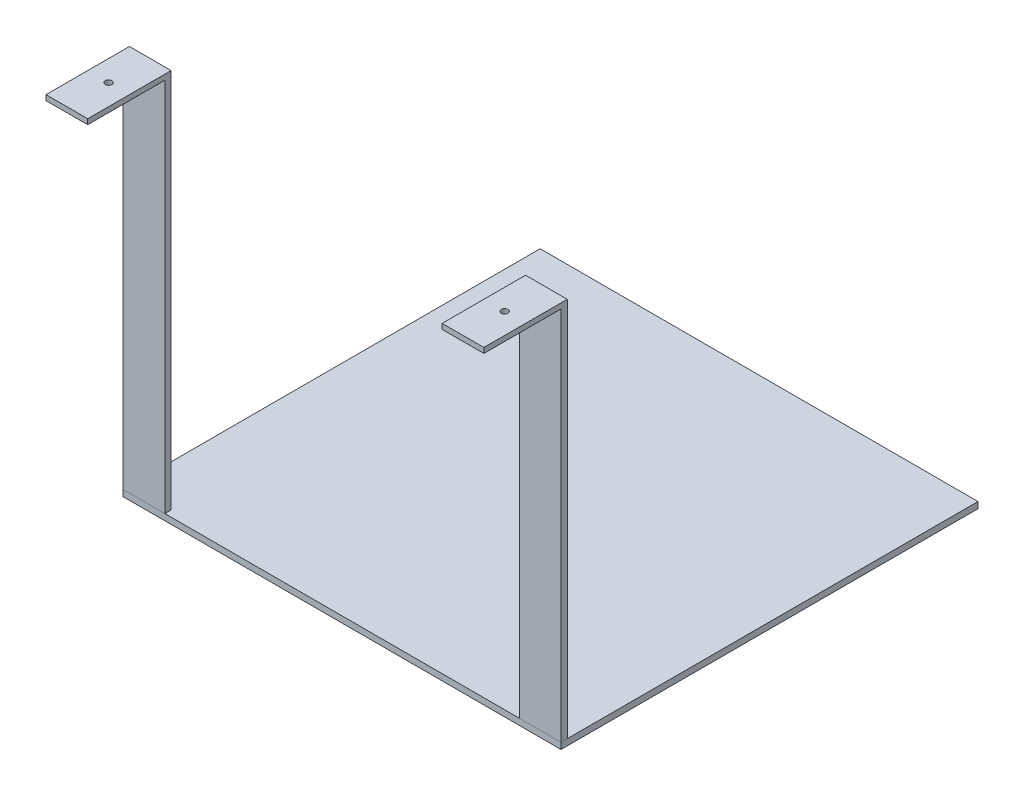
ISO-10303-21;
HEADER;
FILE_DESCRIPTION(('STEP AP214'),'2;1');
FILE_NAME('part.step','',(''),(''),'','','');
FILE_SCHEMA(('AUTOMOTIVE_DESIGN { 1 0 10303 214 1 1 1 1 }'));
ENDSEC;
DATA;
#1=APPLICATION_CONTEXT('core data for automotive mechanical design processes');
#2=APPLICATION_PROTOCOL_DEFINITION('international standard','automotive_design',2000,#1);
#3=PRODUCT_CONTEXT('',#1,'mechanical');
#4=PRODUCT('Part','Part','',(#3));
#5=PRODUCT_RELATED_PRODUCT_CATEGORY('part','',(#4));
#6=PRODUCT_DEFINITION_FORMATION('','',#4);
#7=PRODUCT_DEFINITION_CONTEXT('part definition',#1,'design');
#8=PRODUCT_DEFINITION('design','',#6,#7);
#9=PRODUCT_DEFINITION_SHAPE('','',#8);
#10=(LENGTH_UNIT() NAMED_UNIT(*) SI_UNIT(.MILLI.,.METRE.));
#11=(NAMED_UNIT(*) PLANE_ANGLE_UNIT() SI_UNIT($,.RADIAN.));
#12=(NAMED_UNIT(*) SI_UNIT($,.STERADIAN.) SOLID_ANGLE_UNIT());
#13=UNCERTAINTY_MEASURE_WITH_UNIT(LENGTH_MEASURE(1.E-05),#10,'distance_accuracy_value','');
#14=(GEOMETRIC_REPRESENTATION_CONTEXT(3) GLOBAL_UNCERTAINTY_ASSIGNED_CONTEXT((#13)) GLOBAL_UNIT_ASSIGNED_CONTEXT((#10,
#11,#12)) REPRESENTATION_CONTEXT('',''));
#15=CARTESIAN_POINT('',(0.,0.,0.));
#16=DIRECTION('',(0.,0.,1.));
#17=DIRECTION('',(1.,0.,0.));
#18=AXIS2_PLACEMENT_3D('',#15,#16,#17);
#19=CARTESIAN_POINT('',(-9.99999999999998,-183.,-217.));
#20=DIRECTION('',(0.,0.,1.));
#21=DIRECTION('',(1.,0.,0.));
#22=AXIS2_PLACEMENT_3D('',#19,#20,#21);
#23=PLANE('',#22);
#24=DIRECTION('',(1.,0.,0.));
#25=VECTOR('',#24,1.);
#26=CARTESIAN_POINT('',(-9.99999999999998,-180.,-217.));
#27=LINE('',#26,#25);
#28=CARTESIAN_POINT('',(-9.99999999999998,-180.,-217.));
#29=VERTEX_POINT('',#28);
#30=CARTESIAN_POINT('',(200.,-180.,-217.));
#31=VERTEX_POINT('',#30);
#32=EDGE_CURVE('E108',#29,#31,#27,.T.);
#33=ORIENTED_EDGE('',*,*,#32,.T.);
#34=DIRECTION('',(0.,1.,0.));
#35=VECTOR('',#34,1.);
#36=CARTESIAN_POINT('',(200.,-183.,-217.));
#37=LINE('',#36,#35);
#38=CARTESIAN_POINT('',(200.,-183.,-217.));
#39=VERTEX_POINT('',#38);
#40=EDGE_CURVE('E12',#39,#31,#37,.T.);
#41=ORIENTED_EDGE('',*,*,#40,.F.);
#42=DIRECTION('',(1.,0.,0.));
#43=VECTOR('',#42,1.);
#44=CARTESIAN_POINT('',(-9.99999999999998,-183.,-217.));
#45=LINE('',#44,#43);
#46=CARTESIAN_POINT('',(-9.99999999999998,-183.,-217.));
#47=VERTEX_POINT('',#46);
#48=EDGE_CURVE('E85',#47,#39,#45,.T.);
#49=ORIENTED_EDGE('',*,*,#48,.F.);
#50=DIRECTION('',(0.,1.,0.));
#51=VECTOR('',#50,1.);
#52=CARTESIAN_POINT('',(-9.99999999999998,-183.,-217.));
#53=LINE('',#52,#51);
#54=EDGE_CURVE('E104',#47,#29,#53,.T.);
#55=ORIENTED_EDGE('',*,*,#54,.T.);
#56=EDGE_LOOP('',(#33,#41,#49,#55));
#57=FACE_BOUND('',#56,.T.);
#58=ADVANCED_FACE('F46',(#57),#23,.F.);
#59=CARTESIAN_POINT('',(200.,-183.,-17.));
#60=DIRECTION('',(1.,0.,0.));
#61=DIRECTION('',(0.,0.,-1.));
#62=AXIS2_PLACEMENT_3D('',#59,#60,#61);
#63=PLANE('',#62);
#64=DIRECTION('',(0.,0.,-1.));
#65=VECTOR('',#64,1.);
#66=CARTESIAN_POINT('',(200.,-180.,-17.));
#67=LINE('',#66,#65);
#68=CARTESIAN_POINT('',(200.,-180.,-17.));
#69=VERTEX_POINT('',#68);
#70=EDGE_CURVE('E94',#69,#31,#67,.T.);
#71=ORIENTED_EDGE('',*,*,#70,.F.);
#72=DIRECTION('',(0.,1.,0.));
#73=VECTOR('',#72,1.);
#74=CARTESIAN_POINT('',(200.,-183.,-17.));
#75=LINE('',#74,#73);
#76=CARTESIAN_POINT('',(200.,-183.,-17.));
#77=VERTEX_POINT('',#76);
#78=EDGE_CURVE('E54',#77,#69,#75,.T.);
#79=ORIENTED_EDGE('',*,*,#78,.F.);
#80=DIRECTION('',(0.,0.,-1.));
#81=VECTOR('',#80,1.);
#82=CARTESIAN_POINT('',(200.,-183.,-17.));
#83=LINE('',#82,#81);
#84=EDGE_CURVE('E92',#77,#39,#83,.T.);
#85=ORIENTED_EDGE('',*,*,#84,.T.);
#86=ORIENTED_EDGE('',*,*,#40,.T.);
#87=EDGE_LOOP('',(#71,#79,#85,#86));
#88=FACE_BOUND('',#87,.T.);
#89=ADVANCED_FACE('F91',(#88),#63,.T.);
#90=CARTESIAN_POINT('',(-10.,-183.,-17.));
#91=DIRECTION('',(0.,0.,1.));
#92=DIRECTION('',(1.,0.,0.));
#93=AXIS2_PLACEMENT_3D('',#90,#91,#92);
#94=PLANE('',#93);
#95=DIRECTION('',(1.,0.,0.));
#96=VECTOR('',#95,1.);
#97=CARTESIAN_POINT('',(-10.,-180.,-17.));
#98=LINE('',#97,#96);
#99=CARTESIAN_POINT('',(-10.,-180.,-17.));
#100=VERTEX_POINT('',#99);
#101=EDGE_CURVE('E112',#100,#69,#98,.T.);
#102=ORIENTED_EDGE('',*,*,#101,.F.);
#103=DIRECTION('',(0.,1.,0.));
#104=VECTOR('',#103,1.);
#105=CARTESIAN_POINT('',(-10.,-183.,-17.));
#106=LINE('',#105,#104);
#107=CARTESIAN_POINT('',(-10.,-183.,-17.));
#108=VERTEX_POINT('',#107);
#109=EDGE_CURVE('E77',#108,#100,#106,.T.);
#110=ORIENTED_EDGE('',*,*,#109,.F.);
#111=DIRECTION('',(1.,0.,0.));
#112=VECTOR('',#111,1.);
#113=CARTESIAN_POINT('',(-10.,-183.,-17.));
#114=LINE('',#113,#112);
#115=EDGE_CURVE('E100',#108,#77,#114,.T.);
#116=ORIENTED_EDGE('',*,*,#115,.T.);
#117=ORIENTED_EDGE('',*,*,#78,.T.);
#118=EDGE_LOOP('',(#102,#110,#116,#117));
#119=FACE_BOUND('',#118,.T.);
#120=ADVANCED_FACE('F102',(#119),#94,.T.);
#121=CARTESIAN_POINT('',(-10.,-183.,-17.));
#122=DIRECTION('',(1.,0.,0.));
#123=DIRECTION('',(0.,0.,-1.));
#124=AXIS2_PLACEMENT_3D('',#121,#122,#123);
#125=PLANE('',#124);
#126=DIRECTION('',(0.,0.,-1.));
#127=VECTOR('',#126,1.);
#128=CARTESIAN_POINT('',(-10.,-180.,-17.));
#129=LINE('',#128,#127);
#130=EDGE_CURVE('E80',#100,#29,#129,.T.);
#131=ORIENTED_EDGE('',*,*,#130,.T.);
#132=ORIENTED_EDGE('',*,*,#54,.F.);
#133=DIRECTION('',(0.,0.,-1.));
#134=VECTOR('',#133,1.);
#135=CARTESIAN_POINT('',(-10.,-183.,-17.));
#136=LINE('',#135,#134);
#137=EDGE_CURVE('E62',#108,#47,#136,.T.);
#138=ORIENTED_EDGE('',*,*,#137,.F.);
#139=ORIENTED_EDGE('',*,*,#109,.T.);
#140=EDGE_LOOP('',(#131,#132,#138,#139));
#141=FACE_BOUND('',#140,.T.);
#142=ADVANCED_FACE('F125',(#141),#125,.F.);
#143=CARTESIAN_POINT('',(0.,-183.,0.));
#144=DIRECTION('',(0.,1.,0.));
#145=DIRECTION('',(0.,0.,1.));
#146=AXIS2_PLACEMENT_3D('',#143,#144,#145);
#147=PLANE('',#146);
#148=ORIENTED_EDGE('',*,*,#48,.T.);
#149=ORIENTED_EDGE('',*,*,#84,.F.);
#150=ORIENTED_EDGE('',*,*,#115,.F.);
#151=ORIENTED_EDGE('',*,*,#137,.T.);
#152=EDGE_LOOP('',(#148,#149,#150,#151));
#153=FACE_BOUND('',#152,.T.);
#154=ADVANCED_FACE('F99',(#153),#147,.F.);
#155=CARTESIAN_POINT('',(0.,-180.,0.));
#156=DIRECTION('',(0.,1.,0.));
#157=DIRECTION('',(0.,0.,1.));
#158=AXIS2_PLACEMENT_3D('',#155,#156,#157);
#159=PLANE('',#158);
#160=ORIENTED_EDGE('',*,*,#32,.F.);
#161=ORIENTED_EDGE('',*,*,#130,.F.);
#162=ORIENTED_EDGE('',*,*,#101,.T.);
#163=ORIENTED_EDGE('',*,*,#70,.T.);
#164=EDGE_LOOP('',(#160,#161,#162,#163));
#165=FACE_BOUND('',#164,.T.);
#166=ADVANCED_FACE('F119',(#165),#159,.T.);
#167=CLOSED_SHELL('',(#58,#89,#120,#142,#154,#166));
#168=MANIFOLD_SOLID_BREP('B2',#167);
#169=CARTESIAN_POINT('',(0.,2.5,0.));
#170=DIRECTION('',(0.,-1.,0.));
#171=DIRECTION('',(0.,0.,-1.));
#172=AXIS2_PLACEMENT_3D('',#169,#170,#171);
#173=PLANE('',#172);
#174=DIRECTION('',(0.,0.,1.));
#175=VECTOR('',#174,1.);
#176=CARTESIAN_POINT('',(180.,2.5,20.));
#177=LINE('',#176,#175);
#178=CARTESIAN_POINT('',(180.,2.5,-20.));
#179=VERTEX_POINT('',#178);
#180=CARTESIAN_POINT('',(180.,2.5,20.));
#181=VERTEX_POINT('',#180);
#182=EDGE_CURVE('E273',#179,#181,#177,.T.);
#183=ORIENTED_EDGE('',*,*,#182,.T.);
#184=DIRECTION('',(1.,0.,0.));
#185=VECTOR('',#184,1.);
#186=CARTESIAN_POINT('',(180.,2.5,20.));
#187=LINE('',#186,#185);
#188=CARTESIAN_POINT('',(200.,2.5,20.));
#189=VERTEX_POINT('',#188);
#190=EDGE_CURVE('E223',#181,#189,#187,.T.);
#191=ORIENTED_EDGE('',*,*,#190,.T.);
#192=DIRECTION('',(0.,0.,-1.));
#193=VECTOR('',#192,1.);
#194=CARTESIAN_POINT('',(200.,2.5,20.));
#195=LINE('',#194,#193);
#196=CARTESIAN_POINT('',(200.,2.5,-20.));
#197=VERTEX_POINT('',#196);
#198=EDGE_CURVE('E277',#189,#197,#195,.T.);
#199=ORIENTED_EDGE('',*,*,#198,.T.);
#200=DIRECTION('',(-1.,0.,0.));
#201=VECTOR('',#200,1.);
#202=CARTESIAN_POINT('',(180.,2.5,-20.));
#203=LINE('',#202,#201);
#204=EDGE_CURVE('E203',#197,#179,#203,.T.);
#205=ORIENTED_EDGE('',*,*,#204,.T.);
#206=EDGE_LOOP('',(#183,#191,#199,#205));
#207=FACE_BOUND('',#206,.T.);
#208=CARTESIAN_POINT('',(190.,2.5,0.));
#209=DIRECTION('',(0.,1.,0.));
#210=DIRECTION('',(0.,0.,-1.));
#211=AXIS2_PLACEMENT_3D('',#208,#209,#210);
#212=CIRCLE('',#211,1.59999999999999);
#213=CARTESIAN_POINT('',(190.,2.5,-1.59999999999998));
#214=VERTEX_POINT('',#213);
#215=EDGE_CURVE('E243',#214,#214,#212,.T.);
#216=ORIENTED_EDGE('',*,*,#215,.F.);
#217=EDGE_LOOP('',(#216));
#218=FACE_BOUND('',#217,.T.);
#219=ADVANCED_FACE('F179',(#207,#218),#173,.F.);
#220=CARTESIAN_POINT('',(0.,0.,0.));
#221=DIRECTION('',(0.,-1.,0.));
#222=DIRECTION('',(0.,0.,-1.));
#223=AXIS2_PLACEMENT_3D('',#220,#221,#222);
#224=PLANE('',#223);
#225=DIRECTION('',(-1.,0.,0.));
#226=VECTOR('',#225,1.);
#227=CARTESIAN_POINT('',(200.,0.,-17.));
#228=LINE('',#227,#226);
#229=CARTESIAN_POINT('',(200.,0.,-17.));
#230=VERTEX_POINT('',#229);
#231=CARTESIAN_POINT('',(180.,0.,-17.));
#232=VERTEX_POINT('',#231);
#233=EDGE_CURVE('E194',#230,#232,#228,.T.);
#234=ORIENTED_EDGE('',*,*,#233,.F.);
#235=DIRECTION('',(0.,0.,-1.));
#236=VECTOR('',#235,1.);
#237=CARTESIAN_POINT('',(200.,0.,20.));
#238=LINE('',#237,#236);
#239=CARTESIAN_POINT('',(200.,0.,20.));
#240=VERTEX_POINT('',#239);
#241=EDGE_CURVE('E275',#240,#230,#238,.T.);
#242=ORIENTED_EDGE('',*,*,#241,.F.);
#243=DIRECTION('',(1.,0.,0.));
#244=VECTOR('',#243,1.);
#245=CARTESIAN_POINT('',(180.,0.,20.));
#246=LINE('',#245,#244);
#247=CARTESIAN_POINT('',(180.,0.,20.));
#248=VERTEX_POINT('',#247);
#249=EDGE_CURVE('E218',#248,#240,#246,.T.);
#250=ORIENTED_EDGE('',*,*,#249,.F.);
#251=DIRECTION('',(0.,0.,1.));
#252=VECTOR('',#251,1.);
#253=CARTESIAN_POINT('',(180.,0.,20.));
#254=LINE('',#253,#252);
#255=EDGE_CURVE('E237',#232,#248,#254,.T.);
#256=ORIENTED_EDGE('',*,*,#255,.F.);
#257=EDGE_LOOP('',(#234,#242,#250,#256));
#258=FACE_BOUND('',#257,.T.);
#259=CARTESIAN_POINT('',(190.,0.,0.));
#260=DIRECTION('',(0.,1.,0.));
#261=DIRECTION('',(0.,0.,-1.));
#262=AXIS2_PLACEMENT_3D('',#259,#260,#261);
#263=CIRCLE('',#262,1.59999999999999);
#264=CARTESIAN_POINT('',(190.,0.,-1.59999999999998));
#265=VERTEX_POINT('',#264);
#266=EDGE_CURVE('E253',#265,#265,#263,.T.);
#267=ORIENTED_EDGE('',*,*,#266,.T.);
#268=EDGE_LOOP('',(#267));
#269=FACE_BOUND('',#268,.T.);
#270=ADVANCED_FACE('F238',(#258,#269),#224,.T.);
#271=CARTESIAN_POINT('',(180.,2.5,20.));
#272=DIRECTION('',(1.,0.,0.));
#273=DIRECTION('',(0.,0.,-1.));
#274=AXIS2_PLACEMENT_3D('',#271,#272,#273);
#275=PLANE('',#274);
#276=DIRECTION('',(0.,-1.,0.));
#277=VECTOR('',#276,1.);
#278=CARTESIAN_POINT('',(180.,2.5,-20.));
#279=LINE('',#278,#277);
#280=CARTESIAN_POINT('',(180.,-180.,-20.));
#281=VERTEX_POINT('',#280);
#282=EDGE_CURVE('E279',#179,#281,#279,.T.);
#283=ORIENTED_EDGE('',*,*,#282,.T.);
#284=DIRECTION('',(0.,0.,-1.));
#285=VECTOR('',#284,1.);
#286=CARTESIAN_POINT('',(180.,-180.,-17.));
#287=LINE('',#286,#285);
#288=CARTESIAN_POINT('',(180.,-180.,-17.));
#289=VERTEX_POINT('',#288);
#290=EDGE_CURVE('E257',#289,#281,#287,.T.);
#291=ORIENTED_EDGE('',*,*,#290,.F.);
#292=DIRECTION('',(0.,1.,0.));
#293=VECTOR('',#292,1.);
#294=CARTESIAN_POINT('',(180.,-180.,-17.));
#295=LINE('',#294,#293);
#296=EDGE_CURVE('E250',#289,#232,#295,.T.);
#297=ORIENTED_EDGE('',*,*,#296,.T.);
#298=ORIENTED_EDGE('',*,*,#255,.T.);
#299=DIRECTION('',(0.,-1.,0.));
#300=VECTOR('',#299,1.);
#301=CARTESIAN_POINT('',(180.,2.5,20.));
#302=LINE('',#301,#300);
#303=EDGE_CURVE('E44',#181,#248,#302,.T.);
#304=ORIENTED_EDGE('',*,*,#303,.F.);
#305=ORIENTED_EDGE('',*,*,#182,.F.);
#306=EDGE_LOOP('',(#283,#291,#297,#298,#304,#305));
#307=FACE_BOUND('',#306,.T.);
#308=ADVANCED_FACE('F181',(#307),#275,.F.);
#309=CARTESIAN_POINT('',(180.,2.5,20.));
#310=DIRECTION('',(0.,0.,-1.));
#311=DIRECTION('',(-1.,0.,0.));
#312=AXIS2_PLACEMENT_3D('',#309,#310,#311);
#313=PLANE('',#312);
#314=ORIENTED_EDGE('',*,*,#249,.T.);
#315=DIRECTION('',(0.,-1.,0.));
#316=VECTOR('',#315,1.);
#317=CARTESIAN_POINT('',(200.,2.5,20.));
#318=LINE('',#317,#316);
#319=EDGE_CURVE('E187',#189,#240,#318,.T.);
#320=ORIENTED_EDGE('',*,*,#319,.F.);
#321=ORIENTED_EDGE('',*,*,#190,.F.);
#322=ORIENTED_EDGE('',*,*,#303,.T.);
#323=EDGE_LOOP('',(#314,#320,#321,#322));
#324=FACE_BOUND('',#323,.T.);
#325=ADVANCED_FACE('F289',(#324),#313,.F.);
#326=CARTESIAN_POINT('',(200.,2.5,20.));
#327=DIRECTION('',(-1.,0.,0.));
#328=DIRECTION('',(0.,0.,1.));
#329=AXIS2_PLACEMENT_3D('',#326,#327,#328);
#330=PLANE('',#329);
#331=ORIENTED_EDGE('',*,*,#241,.T.);
#332=DIRECTION('',(0.,1.,0.));
#333=VECTOR('',#332,1.);
#334=CARTESIAN_POINT('',(200.,-180.,-17.));
#335=LINE('',#334,#333);
#336=CARTESIAN_POINT('',(200.,-180.,-17.));
#337=VERTEX_POINT('',#336);
#338=EDGE_CURVE('E252',#337,#230,#335,.T.);
#339=ORIENTED_EDGE('',*,*,#338,.F.);
#340=DIRECTION('',(0.,0.,-1.));
#341=VECTOR('',#340,1.);
#342=CARTESIAN_POINT('',(200.,-180.,-17.));
#343=LINE('',#342,#341);
#344=CARTESIAN_POINT('',(200.,-180.,-20.));
#345=VERTEX_POINT('',#344);
#346=EDGE_CURVE('E254',#337,#345,#343,.T.);
#347=ORIENTED_EDGE('',*,*,#346,.T.);
#348=DIRECTION('',(0.,-1.,0.));
#349=VECTOR('',#348,1.);
#350=CARTESIAN_POINT('',(200.,2.5,-20.));
#351=LINE('',#350,#349);
#352=EDGE_CURVE('E284',#197,#345,#351,.T.);
#353=ORIENTED_EDGE('',*,*,#352,.F.);
#354=ORIENTED_EDGE('',*,*,#198,.F.);
#355=ORIENTED_EDGE('',*,*,#319,.T.);
#356=EDGE_LOOP('',(#331,#339,#347,#353,#354,#355));
#357=FACE_BOUND('',#356,.T.);
#358=ADVANCED_FACE('F287',(#357),#330,.F.);
#359=CARTESIAN_POINT('',(180.,2.5,-20.));
#360=DIRECTION('',(0.,0.,1.));
#361=DIRECTION('',(1.,0.,0.));
#362=AXIS2_PLACEMENT_3D('',#359,#360,#361);
#363=PLANE('',#362);
#364=ORIENTED_EDGE('',*,*,#352,.T.);
#365=DIRECTION('',(-1.,0.,0.));
#366=VECTOR('',#365,1.);
#367=CARTESIAN_POINT('',(200.,-180.,-20.));
#368=LINE('',#367,#366);
#369=EDGE_CURVE('E264',#345,#281,#368,.T.);
#370=ORIENTED_EDGE('',*,*,#369,.T.);
#371=ORIENTED_EDGE('',*,*,#282,.F.);
#372=ORIENTED_EDGE('',*,*,#204,.F.);
#373=EDGE_LOOP('',(#364,#370,#371,#372));
#374=FACE_BOUND('',#373,.T.);
#375=ADVANCED_FACE('F295',(#374),#363,.F.);
#376=CARTESIAN_POINT('',(190.,2.5,0.));
#377=DIRECTION('',(0.,-1.,0.));
#378=DIRECTION('',(0.,0.,-1.));
#379=AXIS2_PLACEMENT_3D('',#376,#377,#378);
#380=CYLINDRICAL_SURFACE('',#379,1.59999999999999);
#381=ORIENTED_EDGE('',*,*,#215,.T.);
#382=EDGE_LOOP('',(#381));
#383=FACE_BOUND('',#382,.T.);
#384=ORIENTED_EDGE('',*,*,#266,.F.);
#385=EDGE_LOOP('',(#384));
#386=FACE_BOUND('',#385,.T.);
#387=ADVANCED_FACE('F305',(#383,#386),#380,.F.);
#388=CARTESIAN_POINT('',(200.,-180.,-17.));
#389=DIRECTION('',(0.,0.,-1.));
#390=DIRECTION('',(-1.,0.,0.));
#391=AXIS2_PLACEMENT_3D('',#388,#389,#390);
#392=PLANE('',#391);
#393=ORIENTED_EDGE('',*,*,#233,.T.);
#394=ORIENTED_EDGE('',*,*,#296,.F.);
#395=DIRECTION('',(-1.,0.,0.));
#396=VECTOR('',#395,1.);
#397=CARTESIAN_POINT('',(200.,-180.,-17.));
#398=LINE('',#397,#396);
#399=EDGE_CURVE('E258',#337,#289,#398,.T.);
#400=ORIENTED_EDGE('',*,*,#399,.F.);
#401=ORIENTED_EDGE('',*,*,#338,.T.);
#402=EDGE_LOOP('',(#393,#394,#400,#401));
#403=FACE_BOUND('',#402,.T.);
#404=ADVANCED_FACE('F248',(#403),#392,.F.);
#405=CARTESIAN_POINT('',(0.,-180.,0.));
#406=DIRECTION('',(0.,1.,0.));
#407=DIRECTION('',(0.,0.,1.));
#408=AXIS2_PLACEMENT_3D('',#405,#406,#407);
#409=PLANE('',#408);
#410=ORIENTED_EDGE('',*,*,#346,.F.);
#411=ORIENTED_EDGE('',*,*,#399,.T.);
#412=ORIENTED_EDGE('',*,*,#290,.T.);
#413=ORIENTED_EDGE('',*,*,#369,.F.);
#414=EDGE_LOOP('',(#410,#411,#412,#413));
#415=FACE_BOUND('',#414,.T.);
#416=ADVANCED_FACE('F317',(#415),#409,.F.);
#417=CLOSED_SHELL('',(#219,#270,#308,#325,#358,#375,#387,#404,#416));
#418=MANIFOLD_SOLID_BREP('B6',#417);
#419=CARTESIAN_POINT('',(0.,2.5,0.));
#420=DIRECTION('',(0.,1.,0.));
#421=DIRECTION('',(0.,0.,1.));
#422=AXIS2_PLACEMENT_3D('',#419,#420,#421);
#423=PLANE('',#422);
#424=DIRECTION('',(0.,0.,1.));
#425=VECTOR('',#424,1.);
#426=CARTESIAN_POINT('',(-10.,2.5,20.));
#427=LINE('',#426,#425);
#428=CARTESIAN_POINT('',(-10.,2.5,-20.));
#429=VERTEX_POINT('',#428);
#430=CARTESIAN_POINT('',(-10.,2.5,20.));
#431=VERTEX_POINT('',#430);
#432=EDGE_CURVE('E483',#429,#431,#427,.T.);
#433=ORIENTED_EDGE('',*,*,#432,.T.);
#434=DIRECTION('',(1.,0.,0.));
#435=VECTOR('',#434,1.);
#436=CARTESIAN_POINT('',(10.,2.5,20.));
#437=LINE('',#436,#435);
#438=CARTESIAN_POINT('',(10.,2.5,20.));
#439=VERTEX_POINT('',#438);
#440=EDGE_CURVE('E429',#431,#439,#437,.T.);
#441=ORIENTED_EDGE('',*,*,#440,.T.);
#442=DIRECTION('',(0.,0.,-1.));
#443=VECTOR('',#442,1.);
#444=CARTESIAN_POINT('',(10.,2.5,20.));
#445=LINE('',#444,#443);
#446=CARTESIAN_POINT('',(10.,2.5,-20.));
#447=VERTEX_POINT('',#446);
#448=EDGE_CURVE('E487',#439,#447,#445,.T.);
#449=ORIENTED_EDGE('',*,*,#448,.T.);
#450=DIRECTION('',(-1.,0.,0.));
#451=VECTOR('',#450,1.);
#452=CARTESIAN_POINT('',(10.,2.5,-20.));
#453=LINE('',#452,#451);
#454=EDGE_CURVE('E409',#447,#429,#453,.T.);
#455=ORIENTED_EDGE('',*,*,#454,.T.);
#456=EDGE_LOOP('',(#433,#441,#449,#455));
#457=FACE_BOUND('',#456,.T.);
#458=CARTESIAN_POINT('',(0.,2.5,0.));
#459=DIRECTION('',(0.,1.,0.));
#460=DIRECTION('',(0.,0.,1.));
#461=AXIS2_PLACEMENT_3D('',#458,#459,#460);
#462=CIRCLE('',#461,1.6);
#463=CARTESIAN_POINT('',(0.,2.5,1.60000000000001));
#464=VERTEX_POINT('',#463);
#465=EDGE_CURVE('E477',#464,#464,#462,.T.);
#466=ORIENTED_EDGE('',*,*,#465,.F.);
#467=EDGE_LOOP('',(#466));
#468=FACE_BOUND('',#467,.T.);
#469=ADVANCED_FACE('F385',(#457,#468),#423,.T.);
#470=CARTESIAN_POINT('',(0.,0.,0.));
#471=DIRECTION('',(0.,1.,0.));
#472=DIRECTION('',(0.,0.,1.));
#473=AXIS2_PLACEMENT_3D('',#470,#471,#472);
#474=PLANE('',#473);
#475=DIRECTION('',(0.,0.,1.));
#476=VECTOR('',#475,1.);
#477=CARTESIAN_POINT('',(-10.,0.,20.));
#478=LINE('',#477,#476);
#479=CARTESIAN_POINT('',(-10.,0.,-17.));
#480=VERTEX_POINT('',#479);
#481=CARTESIAN_POINT('',(-10.,0.,20.));
#482=VERTEX_POINT('',#481);
#483=EDGE_CURVE('E480',#480,#482,#478,.T.);
#484=ORIENTED_EDGE('',*,*,#483,.F.);
#485=DIRECTION('',(1.,0.,0.));
#486=VECTOR('',#485,1.);
#487=CARTESIAN_POINT('',(-10.,0.,-17.));
#488=LINE('',#487,#486);
#489=CARTESIAN_POINT('',(10.,0.,-17.));
#490=VERTEX_POINT('',#489);
#491=EDGE_CURVE('E463',#480,#490,#488,.T.);
#492=ORIENTED_EDGE('',*,*,#491,.T.);
#493=DIRECTION('',(0.,0.,-1.));
#494=VECTOR('',#493,1.);
#495=CARTESIAN_POINT('',(10.,0.,20.));
#496=LINE('',#495,#494);
#497=CARTESIAN_POINT('',(10.,0.,20.));
#498=VERTEX_POINT('',#497);
#499=EDGE_CURVE('E485',#498,#490,#496,.T.);
#500=ORIENTED_EDGE('',*,*,#499,.F.);
#501=DIRECTION('',(1.,0.,0.));
#502=VECTOR('',#501,1.);
#503=CARTESIAN_POINT('',(10.,0.,20.));
#504=LINE('',#503,#502);
#505=EDGE_CURVE('E424',#482,#498,#504,.T.);
#506=ORIENTED_EDGE('',*,*,#505,.F.);
#507=EDGE_LOOP('',(#484,#492,#500,#506));
#508=FACE_BOUND('',#507,.T.);
#509=CARTESIAN_POINT('',(0.,0.,0.));
#510=DIRECTION('',(0.,1.,0.));
#511=DIRECTION('',(0.,0.,1.));
#512=AXIS2_PLACEMENT_3D('',#509,#510,#511);
#513=CIRCLE('',#512,1.6);
#514=CARTESIAN_POINT('',(0.,0.,1.60000000000001));
#515=VERTEX_POINT('',#514);
#516=EDGE_CURVE('E476',#515,#515,#513,.T.);
#517=ORIENTED_EDGE('',*,*,#516,.T.);
#518=EDGE_LOOP('',(#517));
#519=FACE_BOUND('',#518,.T.);
#520=ADVANCED_FACE('F496',(#508,#519),#474,.F.);
#521=CARTESIAN_POINT('',(-10.,2.5,20.));
#522=DIRECTION('',(1.,0.,0.));
#523=DIRECTION('',(0.,0.,-1.));
#524=AXIS2_PLACEMENT_3D('',#521,#522,#523);
#525=PLANE('',#524);
#526=DIRECTION('',(0.,-1.,0.));
#527=VECTOR('',#526,1.);
#528=CARTESIAN_POINT('',(-10.,2.5,-20.));
#529=LINE('',#528,#527);
#530=CARTESIAN_POINT('',(-10.,-180.,-20.));
#531=VERTEX_POINT('',#530);
#532=EDGE_CURVE('E453',#429,#531,#529,.T.);
#533=ORIENTED_EDGE('',*,*,#532,.T.);
#534=DIRECTION('',(0.,0.,-1.));
#535=VECTOR('',#534,1.);
#536=CARTESIAN_POINT('',(-10.,-180.,-17.));
#537=LINE('',#536,#535);
#538=CARTESIAN_POINT('',(-10.,-180.,-17.));
#539=VERTEX_POINT('',#538);
#540=EDGE_CURVE('E462',#539,#531,#537,.T.);
#541=ORIENTED_EDGE('',*,*,#540,.F.);
#542=DIRECTION('',(0.,1.,0.));
#543=VECTOR('',#542,1.);
#544=CARTESIAN_POINT('',(-10.,-180.,-17.));
#545=LINE('',#544,#543);
#546=EDGE_CURVE('E472',#539,#480,#545,.T.);
#547=ORIENTED_EDGE('',*,*,#546,.T.);
#548=ORIENTED_EDGE('',*,*,#483,.T.);
#549=DIRECTION('',(0.,-1.,0.));
#550=VECTOR('',#549,1.);
#551=CARTESIAN_POINT('',(-10.,2.5,20.));
#552=LINE('',#551,#550);
#553=EDGE_CURVE('E177',#431,#482,#552,.T.);
#554=ORIENTED_EDGE('',*,*,#553,.F.);
#555=ORIENTED_EDGE('',*,*,#432,.F.);
#556=EDGE_LOOP('',(#533,#541,#547,#548,#554,#555));
#557=FACE_BOUND('',#556,.T.);
#558=ADVANCED_FACE('F387',(#557),#525,.F.);
#559=CARTESIAN_POINT('',(10.,2.5,20.));
#560=DIRECTION('',(0.,0.,-1.));
#561=DIRECTION('',(-1.,0.,0.));
#562=AXIS2_PLACEMENT_3D('',#559,#560,#561);
#563=PLANE('',#562);
#564=ORIENTED_EDGE('',*,*,#505,.T.);
#565=DIRECTION('',(0.,-1.,0.));
#566=VECTOR('',#565,1.);
#567=CARTESIAN_POINT('',(10.,2.5,20.));
#568=LINE('',#567,#566);
#569=EDGE_CURVE('E393',#439,#498,#568,.T.);
#570=ORIENTED_EDGE('',*,*,#569,.F.);
#571=ORIENTED_EDGE('',*,*,#440,.F.);
#572=ORIENTED_EDGE('',*,*,#553,.T.);
#573=EDGE_LOOP('',(#564,#570,#571,#572));
#574=FACE_BOUND('',#573,.T.);
#575=ADVANCED_FACE('F517',(#574),#563,.F.);
#576=CARTESIAN_POINT('',(10.,2.5,20.));
#577=DIRECTION('',(-1.,0.,0.));
#578=DIRECTION('',(0.,0.,1.));
#579=AXIS2_PLACEMENT_3D('',#576,#577,#578);
#580=PLANE('',#579);
#581=ORIENTED_EDGE('',*,*,#499,.T.);
#582=DIRECTION('',(0.,1.,0.));
#583=VECTOR('',#582,1.);
#584=CARTESIAN_POINT('',(10.,-180.,-17.));
#585=LINE('',#584,#583);
#586=CARTESIAN_POINT('',(10.,-180.,-17.));
#587=VERTEX_POINT('',#586);
#588=EDGE_CURVE('E400',#587,#490,#585,.T.);
#589=ORIENTED_EDGE('',*,*,#588,.F.);
#590=DIRECTION('',(0.,0.,-1.));
#591=VECTOR('',#590,1.);
#592=CARTESIAN_POINT('',(10.,-180.,-17.));
#593=LINE('',#592,#591);
#594=CARTESIAN_POINT('',(10.,-180.,-20.));
#595=VERTEX_POINT('',#594);
#596=EDGE_CURVE('E460',#587,#595,#593,.T.);
#597=ORIENTED_EDGE('',*,*,#596,.T.);
#598=DIRECTION('',(0.,-1.,0.));
#599=VECTOR('',#598,1.);
#600=CARTESIAN_POINT('',(10.,2.5,-20.));
#601=LINE('',#600,#599);
#602=EDGE_CURVE('E446',#447,#595,#601,.T.);
#603=ORIENTED_EDGE('',*,*,#602,.F.);
#604=ORIENTED_EDGE('',*,*,#448,.F.);
#605=ORIENTED_EDGE('',*,*,#569,.T.);
#606=EDGE_LOOP('',(#581,#589,#597,#603,#604,#605));
#607=FACE_BOUND('',#606,.T.);
#608=ADVANCED_FACE('F466',(#607),#580,.F.);
#609=CARTESIAN_POINT('',(10.,2.5,-20.));
#610=DIRECTION('',(0.,0.,1.));
#611=DIRECTION('',(1.,0.,0.));
#612=AXIS2_PLACEMENT_3D('',#609,#610,#611);
#613=PLANE('',#612);
#614=ORIENTED_EDGE('',*,*,#602,.T.);
#615=DIRECTION('',(1.,0.,0.));
#616=VECTOR('',#615,1.);
#617=CARTESIAN_POINT('',(-10.,-180.,-20.));
#618=LINE('',#617,#616);
#619=EDGE_CURVE('E449',#531,#595,#618,.T.);
#620=ORIENTED_EDGE('',*,*,#619,.F.);
#621=ORIENTED_EDGE('',*,*,#532,.F.);
#622=ORIENTED_EDGE('',*,*,#454,.F.);
#623=EDGE_LOOP('',(#614,#620,#621,#622));
#624=FACE_BOUND('',#623,.T.);
#625=ADVANCED_FACE('F448',(#624),#613,.F.);
#626=CARTESIAN_POINT('',(0.,2.5,0.));
#627=DIRECTION('',(0.,-1.,0.));
#628=DIRECTION('',(0.,0.,-1.));
#629=AXIS2_PLACEMENT_3D('',#626,#627,#628);
#630=CYLINDRICAL_SURFACE('',#629,1.6);
#631=ORIENTED_EDGE('',*,*,#465,.T.);
#632=EDGE_LOOP('',(#631));
#633=FACE_BOUND('',#632,.T.);
#634=ORIENTED_EDGE('',*,*,#516,.F.);
#635=EDGE_LOOP('',(#634));
#636=FACE_BOUND('',#635,.T.);
#637=ADVANCED_FACE('F507',(#633,#636),#630,.F.);
#638=CARTESIAN_POINT('',(-10.,-180.,-17.));
#639=DIRECTION('',(0.,0.,1.));
#640=DIRECTION('',(1.,0.,0.));
#641=AXIS2_PLACEMENT_3D('',#638,#639,#640);
#642=PLANE('',#641);
#643=ORIENTED_EDGE('',*,*,#491,.F.);
#644=ORIENTED_EDGE('',*,*,#546,.F.);
#645=DIRECTION('',(1.,0.,0.));
#646=VECTOR('',#645,1.);
#647=CARTESIAN_POINT('',(-10.,-180.,-17.));
#648=LINE('',#647,#646);
#649=EDGE_CURVE('E467',#539,#587,#648,.T.);
#650=ORIENTED_EDGE('',*,*,#649,.T.);
#651=ORIENTED_EDGE('',*,*,#588,.T.);
#652=EDGE_LOOP('',(#643,#644,#650,#651));
#653=FACE_BOUND('',#652,.T.);
#654=ADVANCED_FACE('F498',(#653),#642,.T.);
#655=CARTESIAN_POINT('',(0.,-180.,0.));
#656=DIRECTION('',(0.,1.,0.));
#657=DIRECTION('',(0.,0.,1.));
#658=AXIS2_PLACEMENT_3D('',#655,#656,#657);
#659=PLANE('',#658);
#660=ORIENTED_EDGE('',*,*,#619,.T.);
#661=ORIENTED_EDGE('',*,*,#596,.F.);
#662=ORIENTED_EDGE('',*,*,#649,.F.);
#663=ORIENTED_EDGE('',*,*,#540,.T.);
#664=EDGE_LOOP('',(#660,#661,#662,#663));
#665=FACE_BOUND('',#664,.T.);
#666=ADVANCED_FACE('F458',(#665),#659,.F.);
#667=CLOSED_SHELL('',(#469,#520,#558,#575,#608,#625,#637,#654,#666));
#668=MANIFOLD_SOLID_BREP('B38',#667);
#669=ADVANCED_BREP_SHAPE_REPRESENTATION('',(#18,#168,#418,#668),#14);
#670=SHAPE_DEFINITION_REPRESENTATION(#9,#669);
ENDSEC;
END-ISO-10303-21;
